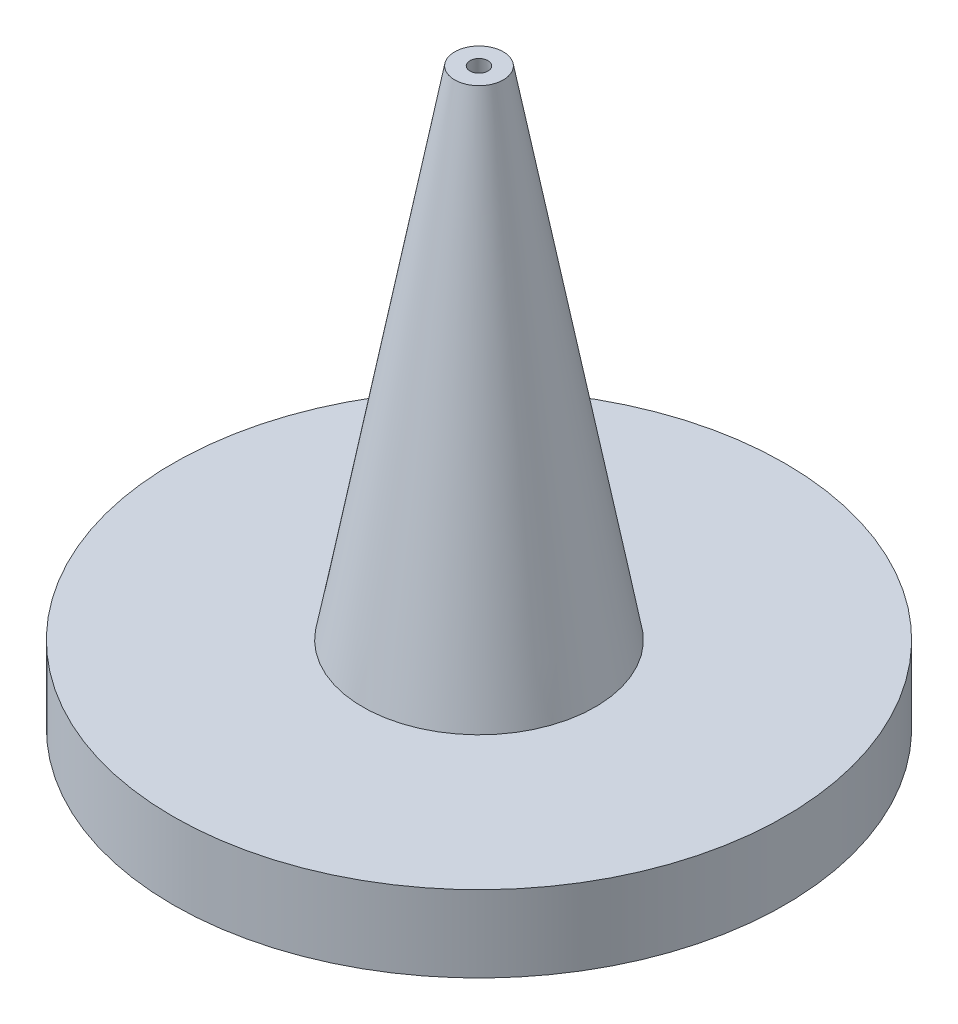
ISO-10303-21;
HEADER;
FILE_DESCRIPTION(('STEP AP214'),'2;1');
FILE_NAME('part.step','',(''),(''),'','','');
FILE_SCHEMA(('AUTOMOTIVE_DESIGN { 1 0 10303 214 1 1 1 1 }'));
ENDSEC;
DATA;
#1=APPLICATION_CONTEXT('core data for automotive mechanical design processes');
#2=APPLICATION_PROTOCOL_DEFINITION('international standard','automotive_design',2000,#1);
#3=PRODUCT_CONTEXT('',#1,'mechanical');
#4=PRODUCT('Part','Part','',(#3));
#5=PRODUCT_RELATED_PRODUCT_CATEGORY('part','',(#4));
#6=PRODUCT_DEFINITION_FORMATION('','',#4);
#7=PRODUCT_DEFINITION_CONTEXT('part definition',#1,'design');
#8=PRODUCT_DEFINITION('design','',#6,#7);
#9=PRODUCT_DEFINITION_SHAPE('','',#8);
#10=(LENGTH_UNIT() NAMED_UNIT(*) SI_UNIT(.MILLI.,.METRE.));
#11=(NAMED_UNIT(*) PLANE_ANGLE_UNIT() SI_UNIT($,.RADIAN.));
#12=(NAMED_UNIT(*) SI_UNIT($,.STERADIAN.) SOLID_ANGLE_UNIT());
#13=UNCERTAINTY_MEASURE_WITH_UNIT(LENGTH_MEASURE(1.E-05),#10,'distance_accuracy_value','');
#14=(GEOMETRIC_REPRESENTATION_CONTEXT(3) GLOBAL_UNCERTAINTY_ASSIGNED_CONTEXT((#13)) GLOBAL_UNIT_ASSIGNED_CONTEXT((#10,
#11,#12)) REPRESENTATION_CONTEXT('',''));
#15=CARTESIAN_POINT('',(0.,0.,0.));
#16=DIRECTION('',(0.,0.,1.));
#17=DIRECTION('',(1.,0.,0.));
#18=AXIS2_PLACEMENT_3D('',#15,#16,#17);
#19=CARTESIAN_POINT('',(0.,0.,0.));
#20=DIRECTION('',(0.,-1.,0.));
#21=DIRECTION('',(0.,0.,-1.));
#22=AXIS2_PLACEMENT_3D('',#19,#20,#21);
#23=CYLINDRICAL_SURFACE('',#22,10.16);
#24=CARTESIAN_POINT('',(0.,2.54,0.));
#25=DIRECTION('',(0.,-1.,0.));
#26=DIRECTION('',(0.,0.,-1.));
#27=AXIS2_PLACEMENT_3D('',#24,#25,#26);
#28=CIRCLE('',#27,10.16);
#29=CARTESIAN_POINT('',(0.,2.54,-10.16));
#30=VERTEX_POINT('',#29);
#31=EDGE_CURVE('E10',#30,#30,#28,.T.);
#32=ORIENTED_EDGE('',*,*,#31,.T.);
#33=EDGE_LOOP('',(#32));
#34=FACE_BOUND('',#33,.T.);
#35=CARTESIAN_POINT('',(0.,0.,0.));
#36=DIRECTION('',(0.,-1.,0.));
#37=DIRECTION('',(0.,0.,-1.));
#38=AXIS2_PLACEMENT_3D('',#35,#36,#37);
#39=CIRCLE('',#38,10.16);
#40=CARTESIAN_POINT('',(0.,0.,-10.16));
#41=VERTEX_POINT('',#40);
#42=EDGE_CURVE('E54',#41,#41,#39,.T.);
#43=ORIENTED_EDGE('',*,*,#42,.F.);
#44=EDGE_LOOP('',(#43));
#45=FACE_BOUND('',#44,.T.);
#46=ADVANCED_FACE('F32',(#34,#45),#23,.T.);
#47=CARTESIAN_POINT('',(0.,2.54,0.));
#48=DIRECTION('',(0.,1.,0.));
#49=DIRECTION('',(0.,0.,1.));
#50=AXIS2_PLACEMENT_3D('',#47,#48,#49);
#51=PLANE('',#50);
#52=CARTESIAN_POINT('',(0.,2.54,0.));
#53=DIRECTION('',(0.,-1.,0.));
#54=DIRECTION('',(0.,0.,-1.));
#55=AXIS2_PLACEMENT_3D('',#52,#53,#54);
#56=CIRCLE('',#55,3.8608);
#57=CARTESIAN_POINT('',(0.,2.54,-3.8608));
#58=VERTEX_POINT('',#57);
#59=EDGE_CURVE('E38',#58,#58,#56,.T.);
#60=ORIENTED_EDGE('',*,*,#59,.T.);
#61=EDGE_LOOP('',(#60));
#62=FACE_BOUND('',#61,.T.);
#63=ORIENTED_EDGE('',*,*,#31,.F.);
#64=EDGE_LOOP('',(#63));
#65=FACE_BOUND('',#64,.T.);
#66=ADVANCED_FACE('F62',(#62,#65),#51,.T.);
#67=CARTESIAN_POINT('',(0.,19.05,0.));
#68=DIRECTION('',(0.,-1.,0.));
#69=DIRECTION('',(0.,0.,-1.));
#70=AXIS2_PLACEMENT_3D('',#67,#68,#69);
#71=CONICAL_SURFACE('',#70,0.80772,0.1828573877048);
#72=CARTESIAN_POINT('',(0.,19.05,0.));
#73=DIRECTION('',(0.,-1.,0.));
#74=DIRECTION('',(0.,0.,-1.));
#75=AXIS2_PLACEMENT_3D('',#72,#73,#74);
#76=CIRCLE('',#75,0.80772);
#77=CARTESIAN_POINT('',(0.,19.05,-0.80772));
#78=VERTEX_POINT('',#77);
#79=EDGE_CURVE('E42',#78,#78,#76,.T.);
#80=CARTESIAN_POINT('',(0.,2.54,-3.8608));
#81=CARTESIAN_POINT('',(0.,2.71197916666667,-3.82899708333333));
#82=CARTESIAN_POINT('',(0.,2.88395833333333,-3.79719416666667));
#83=CARTESIAN_POINT('',(0.,3.22791666666667,-3.73358833333333));
#84=CARTESIAN_POINT('',(0.,3.39989583333333,-3.70178541666667));
#85=CARTESIAN_POINT('',(0.,3.74385416666667,-3.63817958333333));
#86=CARTESIAN_POINT('',(0.,3.91583333333333,-3.60637666666667));
#87=CARTESIAN_POINT('',(0.,4.25979166666667,-3.54277083333333));
#88=CARTESIAN_POINT('',(0.,4.43177083333333,-3.51096791666667));
#89=CARTESIAN_POINT('',(0.,4.77572916666667,-3.44736208333333));
#90=CARTESIAN_POINT('',(0.,4.94770833333333,-3.41555916666667));
#91=CARTESIAN_POINT('',(0.,5.29166666666667,-3.35195333333333));
#92=CARTESIAN_POINT('',(0.,5.46364583333334,-3.32015041666667));
#93=CARTESIAN_POINT('',(0.,5.80760416666667,-3.25654458333333));
#94=CARTESIAN_POINT('',(0.,5.97958333333333,-3.22474166666667));
#95=CARTESIAN_POINT('',(0.,6.32354166666667,-3.16113583333333));
#96=CARTESIAN_POINT('',(0.,6.49552083333333,-3.12933291666667));
#97=CARTESIAN_POINT('',(0.,6.83947916666667,-3.06572708333333));
#98=CARTESIAN_POINT('',(0.,7.01145833333333,-3.03392416666667));
#99=CARTESIAN_POINT('',(0.,7.35541666666667,-2.97031833333333));
#100=CARTESIAN_POINT('',(0.,7.52739583333334,-2.93851541666667));
#101=CARTESIAN_POINT('',(0.,7.87135416666667,-2.87490958333333));
#102=CARTESIAN_POINT('',(0.,8.04333333333333,-2.84310666666667));
#103=CARTESIAN_POINT('',(0.,8.38729166666667,-2.77950083333333));
#104=CARTESIAN_POINT('',(0.,8.55927083333333,-2.74769791666667));
#105=CARTESIAN_POINT('',(0.,8.90322916666667,-2.68409208333333));
#106=CARTESIAN_POINT('',(0.,9.07520833333333,-2.65228916666667));
#107=CARTESIAN_POINT('',(0.,9.41916666666667,-2.58868333333333));
#108=CARTESIAN_POINT('',(0.,9.59114583333333,-2.55688041666667));
#109=CARTESIAN_POINT('',(0.,9.93510416666667,-2.49327458333333));
#110=CARTESIAN_POINT('',(0.,10.1070833333333,-2.46147166666667));
#111=CARTESIAN_POINT('',(0.,10.4510416666667,-2.39786583333333));
#112=CARTESIAN_POINT('',(0.,10.6230208333333,-2.36606291666667));
#113=CARTESIAN_POINT('',(0.,10.9669791666667,-2.30245708333333));
#114=CARTESIAN_POINT('',(0.,11.1389583333333,-2.27065416666667));
#115=CARTESIAN_POINT('',(0.,11.4829166666667,-2.20704833333333));
#116=CARTESIAN_POINT('',(0.,11.6548958333333,-2.17524541666667));
#117=CARTESIAN_POINT('',(0.,11.9988541666667,-2.11163958333333));
#118=CARTESIAN_POINT('',(0.,12.1708333333333,-2.07983666666667));
#119=CARTESIAN_POINT('',(0.,12.5147916666667,-2.01623083333333));
#120=CARTESIAN_POINT('',(0.,12.6867708333333,-1.98442791666667));
#121=CARTESIAN_POINT('',(0.,13.0307291666667,-1.92082208333333));
#122=CARTESIAN_POINT('',(0.,13.2027083333333,-1.88901916666667));
#123=CARTESIAN_POINT('',(0.,13.5466666666667,-1.82541333333333));
#124=CARTESIAN_POINT('',(0.,13.7186458333333,-1.79361041666667));
#125=CARTESIAN_POINT('',(0.,14.0626041666667,-1.73000458333333));
#126=CARTESIAN_POINT('',(0.,14.2345833333333,-1.69820166666667));
#127=CARTESIAN_POINT('',(0.,14.5785416666667,-1.63459583333333));
#128=CARTESIAN_POINT('',(0.,14.7505208333333,-1.60279291666667));
#129=CARTESIAN_POINT('',(0.,15.0944791666667,-1.53918708333333));
#130=CARTESIAN_POINT('',(0.,15.2664583333333,-1.50738416666667));
#131=CARTESIAN_POINT('',(0.,15.6104166666667,-1.44377833333333));
#132=CARTESIAN_POINT('',(0.,15.7823958333333,-1.41197541666667));
#133=CARTESIAN_POINT('',(0.,16.1263541666667,-1.34836958333333));
#134=CARTESIAN_POINT('',(0.,16.2983333333333,-1.31656666666667));
#135=CARTESIAN_POINT('',(0.,16.6422916666667,-1.25296083333333));
#136=CARTESIAN_POINT('',(0.,16.8142708333333,-1.22115791666667));
#137=CARTESIAN_POINT('',(0.,17.1582291666667,-1.15755208333333));
#138=CARTESIAN_POINT('',(0.,17.3302083333333,-1.12574916666667));
#139=CARTESIAN_POINT('',(0.,17.6741666666667,-1.06214333333333));
#140=CARTESIAN_POINT('',(0.,17.8461458333333,-1.03034041666667));
#141=CARTESIAN_POINT('',(0.,18.1901041666667,-0.966734583333333));
#142=CARTESIAN_POINT('',(0.,18.3620833333333,-0.934931666666666));
#143=CARTESIAN_POINT('',(0.,18.7060416666667,-0.871325833333333));
#144=CARTESIAN_POINT('',(0.,18.8780208333333,-0.839522916666666));
#145=CARTESIAN_POINT('',(0.,19.05,-0.807719999999999));
#146=B_SPLINE_CURVE_WITH_KNOTS('',3,(#80,#81,#82,#83,#84,#85,#86,#87,#88,#89,#90,#91,#92,#93,
#94,#95,#96,#97,#98,#99,#100,#101,#102,#103,#104,#105,#106,#107,#108,#109,#110,#111,#112,#113,
#114,#115,#116,#117,#118,#119,#120,#121,#122,#123,#124,#125,#126,#127,#128,#129,#130,#131,#132,
#133,#134,#135,#136,#137,#138,#139,#140,#141,#142,#143,#144,#145),.UNSPECIFIED.,.F.,.F.,(4,2,2,
2,2,2,2,2,2,2,2,2,2,2,2,2,2,2,2,2,2,2,2,2,2,2,2,2,2,2,2,2,4),(0.,0.52468498499844,
1.04936996999688,1.57405495499532,2.09873993999376,2.6234249249922,3.14810990999064,
3.67279489498908,4.19747987998751,4.72216486498595,5.24684984998439,5.77153483498283,
6.29621981998127,6.82090480497971,7.34558978997815,7.87027477497659,8.39495975997503,
8.91964474497347,9.4443297299719,9.96901471497034,10.4936996999688,11.0183846849672,
11.5430696699657,12.0677546549641,12.5924396399625,13.117124624961,13.6418096099594,
14.1664945949579,14.6911795799563,15.2158645649547,15.7405495499532,16.2652345349516,
16.7899195199501),.UNSPECIFIED.);
#147=EDGE_CURVE('BSEAM66',#58,#78,#146,.T.);
#148=ORIENTED_EDGE('',*,*,#59,.F.);
#149=ORIENTED_EDGE('',*,*,#79,.T.);
#150=ORIENTED_EDGE('',*,*,#147,.T.);
#151=ORIENTED_EDGE('',*,*,#147,.F.);
#152=EDGE_LOOP('',(#148,#150,#149,#151));
#153=FACE_BOUND('',#152,.T.);
#154=ADVANCED_FACE('F66',(#153),#71,.T.);
#155=CARTESIAN_POINT('',(0.,19.05,0.));
#156=DIRECTION('',(0.,-1.,0.));
#157=DIRECTION('',(0.,0.,-1.));
#158=AXIS2_PLACEMENT_3D('',#155,#156,#157);
#159=PLANE('',#158);
#160=ORIENTED_EDGE('',*,*,#79,.F.);
#161=EDGE_LOOP('',(#160));
#162=FACE_BOUND('',#161,.T.);
#163=CARTESIAN_POINT('',(0.,19.05,0.));
#164=DIRECTION('',(0.,-1.,0.));
#165=DIRECTION('',(0.,0.,-1.));
#166=AXIS2_PLACEMENT_3D('',#163,#164,#165);
#167=CIRCLE('',#166,0.29972);
#168=CARTESIAN_POINT('',(0.,19.05,-0.29972));
#169=VERTEX_POINT('',#168);
#170=EDGE_CURVE('E46',#169,#169,#167,.T.);
#171=ORIENTED_EDGE('',*,*,#170,.T.);
#172=EDGE_LOOP('',(#171));
#173=FACE_BOUND('',#172,.T.);
#174=ADVANCED_FACE('F70',(#162,#173),#159,.F.);
#175=CARTESIAN_POINT('',(0.,0.,0.));
#176=DIRECTION('',(0.,-1.,0.));
#177=DIRECTION('',(0.,0.,-1.));
#178=AXIS2_PLACEMENT_3D('',#175,#176,#177);
#179=CONICAL_SURFACE('',#178,3.3528,0.158915261764543);
#180=CARTESIAN_POINT('',(0.,0.,0.));
#181=DIRECTION('',(0.,-1.,0.));
#182=DIRECTION('',(0.,0.,-1.));
#183=AXIS2_PLACEMENT_3D('',#180,#181,#182);
#184=CIRCLE('',#183,3.3528);
#185=CARTESIAN_POINT('',(0.,0.,-3.3528));
#186=VERTEX_POINT('',#185);
#187=EDGE_CURVE('E51',#186,#186,#184,.T.);
#188=CARTESIAN_POINT('',(0.,19.05,-0.29972));
#189=CARTESIAN_POINT('',(0.,18.8515625,-0.331522916666666));
#190=CARTESIAN_POINT('',(0.,18.653125,-0.363325833333333));
#191=CARTESIAN_POINT('',(0.,18.25625,-0.426931666666666));
#192=CARTESIAN_POINT('',(0.,18.0578125,-0.458734583333333));
#193=CARTESIAN_POINT('',(0.,17.6609375,-0.522340416666667));
#194=CARTESIAN_POINT('',(0.,17.4625,-0.554143333333333));
#195=CARTESIAN_POINT('',(0.,17.065625,-0.617749166666667));
#196=CARTESIAN_POINT('',(0.,16.8671875,-0.649552083333333));
#197=CARTESIAN_POINT('',(0.,16.4703125,-0.713157916666667));
#198=CARTESIAN_POINT('',(0.,16.271875,-0.744960833333333));
#199=CARTESIAN_POINT('',(0.,15.875,-0.808566666666666));
#200=CARTESIAN_POINT('',(0.,15.6765625,-0.840369583333333));
#201=CARTESIAN_POINT('',(0.,15.2796875,-0.903975416666666));
#202=CARTESIAN_POINT('',(0.,15.08125,-0.935778333333333));
#203=CARTESIAN_POINT('',(0.,14.684375,-0.999384166666666));
#204=CARTESIAN_POINT('',(0.,14.4859375,-1.03118708333333));
#205=CARTESIAN_POINT('',(0.,14.0890625,-1.09479291666667));
#206=CARTESIAN_POINT('',(0.,13.890625,-1.12659583333333));
#207=CARTESIAN_POINT('',(0.,13.49375,-1.19020166666667));
#208=CARTESIAN_POINT('',(0.,13.2953125,-1.22200458333333));
#209=CARTESIAN_POINT('',(0.,12.8984375,-1.28561041666667));
#210=CARTESIAN_POINT('',(0.,12.7,-1.31741333333333));
#211=CARTESIAN_POINT('',(0.,12.303125,-1.38101916666667));
#212=CARTESIAN_POINT('',(0.,12.1046875,-1.41282208333333));
#213=CARTESIAN_POINT('',(0.,11.7078125,-1.47642791666667));
#214=CARTESIAN_POINT('',(0.,11.509375,-1.50823083333333));
#215=CARTESIAN_POINT('',(0.,11.1125,-1.57183666666667));
#216=CARTESIAN_POINT('',(0.,10.9140625,-1.60363958333333));
#217=CARTESIAN_POINT('',(0.,10.5171875,-1.66724541666667));
#218=CARTESIAN_POINT('',(0.,10.31875,-1.69904833333333));
#219=CARTESIAN_POINT('',(0.,9.921875,-1.76265416666667));
#220=CARTESIAN_POINT('',(0.,9.7234375,-1.79445708333333));
#221=CARTESIAN_POINT('',(0.,9.3265625,-1.85806291666667));
#222=CARTESIAN_POINT('',(0.,9.128125,-1.88986583333333));
#223=CARTESIAN_POINT('',(0.,8.73125,-1.95347166666667));
#224=CARTESIAN_POINT('',(0.,8.5328125,-1.98527458333333));
#225=CARTESIAN_POINT('',(0.,8.1359375,-2.04888041666667));
#226=CARTESIAN_POINT('',(0.,7.9375,-2.08068333333333));
#227=CARTESIAN_POINT('',(0.,7.540625,-2.14428916666667));
#228=CARTESIAN_POINT('',(0.,7.3421875,-2.17609208333333));
#229=CARTESIAN_POINT('',(0.,6.9453125,-2.23969791666667));
#230=CARTESIAN_POINT('',(0.,6.746875,-2.27150083333333));
#231=CARTESIAN_POINT('',(0.,6.35,-2.33510666666667));
#232=CARTESIAN_POINT('',(0.,6.1515625,-2.36690958333333));
#233=CARTESIAN_POINT('',(0.,5.7546875,-2.43051541666667));
#234=CARTESIAN_POINT('',(0.,5.55625,-2.46231833333333));
#235=CARTESIAN_POINT('',(0.,5.159375,-2.52592416666667));
#236=CARTESIAN_POINT('',(0.,4.9609375,-2.55772708333333));
#237=CARTESIAN_POINT('',(0.,4.5640625,-2.62133291666667));
#238=CARTESIAN_POINT('',(0.,4.365625,-2.65313583333333));
#239=CARTESIAN_POINT('',(0.,3.96875,-2.71674166666667));
#240=CARTESIAN_POINT('',(0.,3.7703125,-2.74854458333333));
#241=CARTESIAN_POINT('',(0.,3.3734375,-2.81215041666667));
#242=CARTESIAN_POINT('',(0.,3.175,-2.84395333333333));
#243=CARTESIAN_POINT('',(0.,2.778125,-2.90755916666667));
#244=CARTESIAN_POINT('',(0.,2.5796875,-2.93936208333333));
#245=CARTESIAN_POINT('',(0.,2.1828125,-3.00296791666667));
#246=CARTESIAN_POINT('',(0.,1.984375,-3.03477083333333));
#247=CARTESIAN_POINT('',(0.,1.5875,-3.09837666666667));
#248=CARTESIAN_POINT('',(0.,1.3890625,-3.13017958333333));
#249=CARTESIAN_POINT('',(0.,0.992187500000001,-3.19378541666667));
#250=CARTESIAN_POINT('',(0.,0.793750000000001,-3.22558833333333));
#251=CARTESIAN_POINT('',(0.,0.396875,-3.28919416666667));
#252=CARTESIAN_POINT('',(0.,0.1984375,-3.32099708333333));
#253=CARTESIAN_POINT('',(0.,0.,-3.3528));
#254=B_SPLINE_CURVE_WITH_KNOTS('',3,(#188,#189,#190,#191,#192,#193,#194,#195,#196,#197,#198,
#199,#200,#201,#202,#203,#204,#205,#206,#207,#208,#209,#210,#211,#212,#213,#214,#215,#216,#217,
#218,#219,#220,#221,#222,#223,#224,#225,#226,#227,#228,#229,#230,#231,#232,#233,#234,#235,#236,
#237,#238,#239,#240,#241,#242,#243,#244,#245,#246,#247,#248,#249,#250,#251,#252,#253),
.UNSPECIFIED.,.F.,.F.,(4,2,2,2,2,2,2,2,2,2,2,2,2,2,2,2,2,2,2,2,2,2,2,2,2,2,2,2,2,2,2,2,4),(0.,
0.602909447788648,1.2058188955773,1.80872834336595,2.41163779115459,3.01454723894324,
3.61745668673189,4.22036613452054,4.82327558230918,5.42618503009783,6.02909447788648,
6.63200392567513,7.23491337346378,7.83782282125243,8.44073226904107,9.04364171682972,
9.64655116461837,10.249460612407,10.8523700601957,11.4552795079843,12.058188955773,
12.6610984035616,13.2640078513503,13.8669172991389,14.4698267469276,15.0727361947162,
15.6756456425049,16.2785550902935,16.8814645380821,17.4843739858708,18.0872834336594,
18.6901928814481,19.2931023292367),.UNSPECIFIED.);
#255=EDGE_CURVE('BSEAM77',#169,#186,#254,.T.);
#256=ORIENTED_EDGE('',*,*,#170,.F.);
#257=ORIENTED_EDGE('',*,*,#187,.T.);
#258=ORIENTED_EDGE('',*,*,#255,.T.);
#259=ORIENTED_EDGE('',*,*,#255,.F.);
#260=EDGE_LOOP('',(#256,#258,#257,#259));
#261=FACE_BOUND('',#260,.T.);
#262=ADVANCED_FACE('F77',(#261),#179,.F.);
#263=CARTESIAN_POINT('',(0.,0.,0.));
#264=DIRECTION('',(0.,-1.,0.));
#265=DIRECTION('',(0.,0.,-1.));
#266=AXIS2_PLACEMENT_3D('',#263,#264,#265);
#267=PLANE('',#266);
#268=ORIENTED_EDGE('',*,*,#42,.T.);
#269=EDGE_LOOP('',(#268));
#270=FACE_BOUND('',#269,.T.);
#271=ORIENTED_EDGE('',*,*,#187,.F.);
#272=EDGE_LOOP('',(#271));
#273=FACE_BOUND('',#272,.T.);
#274=ADVANCED_FACE('F58',(#270,#273),#267,.T.);
#275=CLOSED_SHELL('',(#46,#66,#154,#174,#262,#274));
#276=MANIFOLD_SOLID_BREP('B2',#275);
#277=ADVANCED_BREP_SHAPE_REPRESENTATION('',(#18,#276),#14);
#278=SHAPE_DEFINITION_REPRESENTATION(#9,#277);
ENDSEC;
END-ISO-10303-21;
